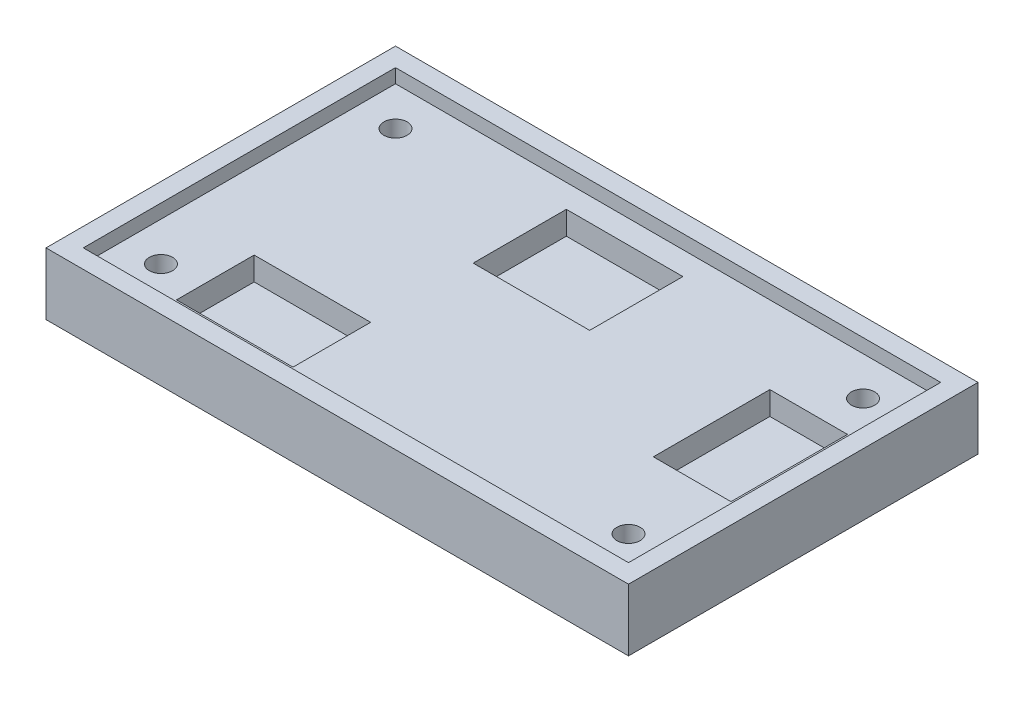
ISO-10303-21;
HEADER;
FILE_DESCRIPTION(('STEP AP214'),'2;1');
FILE_NAME('part.step','',(''),(''),'','','');
FILE_SCHEMA(('AUTOMOTIVE_DESIGN { 1 0 10303 214 1 1 1 1 }'));
ENDSEC;
DATA;
#1=APPLICATION_CONTEXT('core data for automotive mechanical design processes');
#2=APPLICATION_PROTOCOL_DEFINITION('international standard','automotive_design',2000,#1);
#3=PRODUCT_CONTEXT('',#1,'mechanical');
#4=PRODUCT('Part','Part','',(#3));
#5=PRODUCT_RELATED_PRODUCT_CATEGORY('part','',(#4));
#6=PRODUCT_DEFINITION_FORMATION('','',#4);
#7=PRODUCT_DEFINITION_CONTEXT('part definition',#1,'design');
#8=PRODUCT_DEFINITION('design','',#6,#7);
#9=PRODUCT_DEFINITION_SHAPE('','',#8);
#10=(LENGTH_UNIT() NAMED_UNIT(*) SI_UNIT(.MILLI.,.METRE.));
#11=(NAMED_UNIT(*) PLANE_ANGLE_UNIT() SI_UNIT($,.RADIAN.));
#12=(NAMED_UNIT(*) SI_UNIT($,.STERADIAN.) SOLID_ANGLE_UNIT());
#13=UNCERTAINTY_MEASURE_WITH_UNIT(LENGTH_MEASURE(1.E-05),#10,'distance_accuracy_value','');
#14=(GEOMETRIC_REPRESENTATION_CONTEXT(3) GLOBAL_UNCERTAINTY_ASSIGNED_CONTEXT((#13)) GLOBAL_UNIT_ASSIGNED_CONTEXT((#10,
#11,#12)) REPRESENTATION_CONTEXT('',''));
#15=CARTESIAN_POINT('',(0.,0.,0.));
#16=DIRECTION('',(0.,0.,1.));
#17=DIRECTION('',(1.,0.,0.));
#18=AXIS2_PLACEMENT_3D('',#15,#16,#17);
#19=CARTESIAN_POINT('',(0.,8.,-45.));
#20=DIRECTION('',(0.,0.,-1.));
#21=DIRECTION('',(-1.,0.,0.));
#22=AXIS2_PLACEMENT_3D('',#19,#20,#21);
#23=PLANE('',#22);
#24=DIRECTION('',(1.,0.,0.));
#25=VECTOR('',#24,1.);
#26=CARTESIAN_POINT('',(0.,0.,-45.));
#27=LINE('',#26,#25);
#28=CARTESIAN_POINT('',(0.,0.,-45.));
#29=VERTEX_POINT('',#28);
#30=CARTESIAN_POINT('',(75.,0.,-45.));
#31=VERTEX_POINT('',#30);
#32=EDGE_CURVE('E328',#29,#31,#27,.T.);
#33=ORIENTED_EDGE('',*,*,#32,.F.);
#34=DIRECTION('',(0.,-1.,0.));
#35=VECTOR('',#34,1.);
#36=CARTESIAN_POINT('',(0.,8.,-45.));
#37=LINE('',#36,#35);
#38=CARTESIAN_POINT('',(0.,8.,-45.));
#39=VERTEX_POINT('',#38);
#40=EDGE_CURVE('E11',#39,#29,#37,.T.);
#41=ORIENTED_EDGE('',*,*,#40,.F.);
#42=DIRECTION('',(1.,0.,0.));
#43=VECTOR('',#42,1.);
#44=CARTESIAN_POINT('',(0.,8.,-45.));
#45=LINE('',#44,#43);
#46=CARTESIAN_POINT('',(75.,8.,-45.));
#47=VERTEX_POINT('',#46);
#48=EDGE_CURVE('E335',#39,#47,#45,.T.);
#49=ORIENTED_EDGE('',*,*,#48,.T.);
#50=DIRECTION('',(0.,-1.,0.));
#51=VECTOR('',#50,1.);
#52=CARTESIAN_POINT('',(75.,8.,-45.));
#53=LINE('',#52,#51);
#54=EDGE_CURVE('E44',#47,#31,#53,.T.);
#55=ORIENTED_EDGE('',*,*,#54,.T.);
#56=EDGE_LOOP('',(#33,#41,#49,#55));
#57=FACE_BOUND('',#56,.T.);
#58=ADVANCED_FACE('F41',(#57),#23,.T.);
#59=CARTESIAN_POINT('',(0.,8.,0.));
#60=DIRECTION('',(-1.,0.,0.));
#61=DIRECTION('',(0.,0.,1.));
#62=AXIS2_PLACEMENT_3D('',#59,#60,#61);
#63=PLANE('',#62);
#64=DIRECTION('',(0.,0.,-1.));
#65=VECTOR('',#64,1.);
#66=CARTESIAN_POINT('',(0.,0.,0.));
#67=LINE('',#66,#65);
#68=CARTESIAN_POINT('',(0.,0.,0.));
#69=VERTEX_POINT('',#68);
#70=EDGE_CURVE('E339',#69,#29,#67,.T.);
#71=ORIENTED_EDGE('',*,*,#70,.F.);
#72=DIRECTION('',(0.,-1.,0.));
#73=VECTOR('',#72,1.);
#74=CARTESIAN_POINT('',(0.,8.,0.));
#75=LINE('',#74,#73);
#76=CARTESIAN_POINT('',(0.,8.,0.));
#77=VERTEX_POINT('',#76);
#78=EDGE_CURVE('E49',#77,#69,#75,.T.);
#79=ORIENTED_EDGE('',*,*,#78,.F.);
#80=DIRECTION('',(0.,0.,-1.));
#81=VECTOR('',#80,1.);
#82=CARTESIAN_POINT('',(0.,8.,0.));
#83=LINE('',#82,#81);
#84=EDGE_CURVE('E343',#77,#39,#83,.T.);
#85=ORIENTED_EDGE('',*,*,#84,.T.);
#86=ORIENTED_EDGE('',*,*,#40,.T.);
#87=EDGE_LOOP('',(#71,#79,#85,#86));
#88=FACE_BOUND('',#87,.T.);
#89=ADVANCED_FACE('F371',(#88),#63,.T.);
#90=CARTESIAN_POINT('',(0.,8.,0.));
#91=DIRECTION('',(0.,0.,-1.));
#92=DIRECTION('',(-1.,0.,0.));
#93=AXIS2_PLACEMENT_3D('',#90,#91,#92);
#94=PLANE('',#93);
#95=DIRECTION('',(1.,0.,0.));
#96=VECTOR('',#95,1.);
#97=CARTESIAN_POINT('',(0.,0.,0.));
#98=LINE('',#97,#96);
#99=CARTESIAN_POINT('',(75.,0.,0.));
#100=VERTEX_POINT('',#99);
#101=EDGE_CURVE('E351',#69,#100,#98,.T.);
#102=ORIENTED_EDGE('',*,*,#101,.T.);
#103=DIRECTION('',(0.,-1.,0.));
#104=VECTOR('',#103,1.);
#105=CARTESIAN_POINT('',(75.,8.,0.));
#106=LINE('',#105,#104);
#107=CARTESIAN_POINT('',(75.,8.,0.));
#108=VERTEX_POINT('',#107);
#109=EDGE_CURVE('E355',#108,#100,#106,.T.);
#110=ORIENTED_EDGE('',*,*,#109,.F.);
#111=DIRECTION('',(1.,0.,0.));
#112=VECTOR('',#111,1.);
#113=CARTESIAN_POINT('',(0.,8.,0.));
#114=LINE('',#113,#112);
#115=EDGE_CURVE('E341',#77,#108,#114,.T.);
#116=ORIENTED_EDGE('',*,*,#115,.F.);
#117=ORIENTED_EDGE('',*,*,#78,.T.);
#118=EDGE_LOOP('',(#102,#110,#116,#117));
#119=FACE_BOUND('',#118,.T.);
#120=ADVANCED_FACE('F377',(#119),#94,.F.);
#121=CARTESIAN_POINT('',(75.,8.,0.));
#122=DIRECTION('',(-1.,0.,0.));
#123=DIRECTION('',(0.,0.,1.));
#124=AXIS2_PLACEMENT_3D('',#121,#122,#123);
#125=PLANE('',#124);
#126=DIRECTION('',(0.,0.,-1.));
#127=VECTOR('',#126,1.);
#128=CARTESIAN_POINT('',(75.,0.,0.));
#129=LINE('',#128,#127);
#130=EDGE_CURVE('E348',#100,#31,#129,.T.);
#131=ORIENTED_EDGE('',*,*,#130,.T.);
#132=ORIENTED_EDGE('',*,*,#54,.F.);
#133=DIRECTION('',(0.,0.,-1.));
#134=VECTOR('',#133,1.);
#135=CARTESIAN_POINT('',(75.,8.,0.));
#136=LINE('',#135,#134);
#137=EDGE_CURVE('E338',#108,#47,#136,.T.);
#138=ORIENTED_EDGE('',*,*,#137,.F.);
#139=ORIENTED_EDGE('',*,*,#109,.T.);
#140=EDGE_LOOP('',(#131,#132,#138,#139));
#141=FACE_BOUND('',#140,.T.);
#142=ADVANCED_FACE('F365',(#141),#125,.F.);
#143=CARTESIAN_POINT('',(0.,8.,0.));
#144=DIRECTION('',(0.,1.,0.));
#145=DIRECTION('',(0.,0.,1.));
#146=AXIS2_PLACEMENT_3D('',#143,#144,#145);
#147=PLANE('',#146);
#148=DIRECTION('',(0.,0.,1.));
#149=VECTOR('',#148,1.);
#150=CARTESIAN_POINT('',(2.4,8.,-42.6));
#151=LINE('',#150,#149);
#152=CARTESIAN_POINT('',(2.4,8.,-42.6));
#153=VERTEX_POINT('',#152);
#154=CARTESIAN_POINT('',(2.4,8.,-2.4));
#155=VERTEX_POINT('',#154);
#156=EDGE_CURVE('E300',#153,#155,#151,.T.);
#157=ORIENTED_EDGE('',*,*,#156,.F.);
#158=DIRECTION('',(-1.,0.,0.));
#159=VECTOR('',#158,1.);
#160=CARTESIAN_POINT('',(72.6,8.,-42.6));
#161=LINE('',#160,#159);
#162=CARTESIAN_POINT('',(72.6,8.,-42.6));
#163=VERTEX_POINT('',#162);
#164=EDGE_CURVE('E307',#163,#153,#161,.T.);
#165=ORIENTED_EDGE('',*,*,#164,.F.);
#166=DIRECTION('',(0.,0.,-1.));
#167=VECTOR('',#166,1.);
#168=CARTESIAN_POINT('',(72.6,8.,-2.4));
#169=LINE('',#168,#167);
#170=CARTESIAN_POINT('',(72.6,8.,-2.4));
#171=VERTEX_POINT('',#170);
#172=EDGE_CURVE('E321',#171,#163,#169,.T.);
#173=ORIENTED_EDGE('',*,*,#172,.F.);
#174=DIRECTION('',(1.,0.,0.));
#175=VECTOR('',#174,1.);
#176=CARTESIAN_POINT('',(2.4,8.,-2.4));
#177=LINE('',#176,#175);
#178=EDGE_CURVE('E318',#155,#171,#177,.T.);
#179=ORIENTED_EDGE('',*,*,#178,.F.);
#180=EDGE_LOOP('',(#157,#165,#173,#179));
#181=FACE_BOUND('',#180,.T.);
#182=ORIENTED_EDGE('',*,*,#48,.F.);
#183=ORIENTED_EDGE('',*,*,#84,.F.);
#184=ORIENTED_EDGE('',*,*,#115,.T.);
#185=ORIENTED_EDGE('',*,*,#137,.T.);
#186=EDGE_LOOP('',(#182,#183,#184,#185));
#187=FACE_BOUND('',#186,.T.);
#188=ADVANCED_FACE('F375',(#181,#187),#147,.T.);
#189=CARTESIAN_POINT('',(0.,0.,0.));
#190=DIRECTION('',(0.,1.,0.));
#191=DIRECTION('',(0.,0.,1.));
#192=AXIS2_PLACEMENT_3D('',#189,#190,#191);
#193=PLANE('',#192);
#194=ORIENTED_EDGE('',*,*,#32,.T.);
#195=ORIENTED_EDGE('',*,*,#130,.F.);
#196=ORIENTED_EDGE('',*,*,#101,.F.);
#197=ORIENTED_EDGE('',*,*,#70,.T.);
#198=EDGE_LOOP('',(#194,#195,#196,#197));
#199=FACE_BOUND('',#198,.T.);
#200=ADVANCED_FACE('F368',(#199),#193,.F.);
#201=CARTESIAN_POINT('',(2.4,6.2,-42.6));
#202=DIRECTION('',(-1.,0.,0.));
#203=DIRECTION('',(0.,0.,1.));
#204=AXIS2_PLACEMENT_3D('',#201,#202,#203);
#205=PLANE('',#204);
#206=ORIENTED_EDGE('',*,*,#156,.T.);
#207=DIRECTION('',(0.,1.,0.));
#208=VECTOR('',#207,1.);
#209=CARTESIAN_POINT('',(2.4,6.2,-2.4));
#210=LINE('',#209,#208);
#211=CARTESIAN_POINT('',(2.4,6.2,-2.4));
#212=VERTEX_POINT('',#211);
#213=EDGE_CURVE('E316',#212,#155,#210,.T.);
#214=ORIENTED_EDGE('',*,*,#213,.F.);
#215=DIRECTION('',(0.,0.,1.));
#216=VECTOR('',#215,1.);
#217=CARTESIAN_POINT('',(2.4,6.2,-42.6));
#218=LINE('',#217,#216);
#219=CARTESIAN_POINT('',(2.4,6.2,-42.6));
#220=VERTEX_POINT('',#219);
#221=EDGE_CURVE('E303',#220,#212,#218,.T.);
#222=ORIENTED_EDGE('',*,*,#221,.F.);
#223=DIRECTION('',(0.,1.,0.));
#224=VECTOR('',#223,1.);
#225=CARTESIAN_POINT('',(2.4,6.2,-42.6));
#226=LINE('',#225,#224);
#227=EDGE_CURVE('E326',#220,#153,#226,.T.);
#228=ORIENTED_EDGE('',*,*,#227,.T.);
#229=EDGE_LOOP('',(#206,#214,#222,#228));
#230=FACE_BOUND('',#229,.T.);
#231=ADVANCED_FACE('F423',(#230),#205,.F.);
#232=CARTESIAN_POINT('',(72.6,6.2,-42.6));
#233=DIRECTION('',(0.,0.,-1.));
#234=DIRECTION('',(-1.,0.,0.));
#235=AXIS2_PLACEMENT_3D('',#232,#233,#234);
#236=PLANE('',#235);
#237=ORIENTED_EDGE('',*,*,#164,.T.);
#238=ORIENTED_EDGE('',*,*,#227,.F.);
#239=DIRECTION('',(-1.,0.,0.));
#240=VECTOR('',#239,1.);
#241=CARTESIAN_POINT('',(72.6,6.2,-42.6));
#242=LINE('',#241,#240);
#243=CARTESIAN_POINT('',(72.6,6.2,-42.6));
#244=VERTEX_POINT('',#243);
#245=EDGE_CURVE('E313',#244,#220,#242,.T.);
#246=ORIENTED_EDGE('',*,*,#245,.F.);
#247=DIRECTION('',(0.,1.,0.));
#248=VECTOR('',#247,1.);
#249=CARTESIAN_POINT('',(72.6,6.2,-42.6));
#250=LINE('',#249,#248);
#251=EDGE_CURVE('E329',#244,#163,#250,.T.);
#252=ORIENTED_EDGE('',*,*,#251,.T.);
#253=EDGE_LOOP('',(#237,#238,#246,#252));
#254=FACE_BOUND('',#253,.T.);
#255=ADVANCED_FACE('F431',(#254),#236,.F.);
#256=CARTESIAN_POINT('',(72.6,6.2,-2.4));
#257=DIRECTION('',(1.,0.,0.));
#258=DIRECTION('',(0.,0.,-1.));
#259=AXIS2_PLACEMENT_3D('',#256,#257,#258);
#260=PLANE('',#259);
#261=ORIENTED_EDGE('',*,*,#172,.T.);
#262=ORIENTED_EDGE('',*,*,#251,.F.);
#263=DIRECTION('',(0.,0.,-1.));
#264=VECTOR('',#263,1.);
#265=CARTESIAN_POINT('',(72.6,6.2,-2.4));
#266=LINE('',#265,#264);
#267=CARTESIAN_POINT('',(72.6,6.2,-2.4));
#268=VERTEX_POINT('',#267);
#269=EDGE_CURVE('E310',#268,#244,#266,.T.);
#270=ORIENTED_EDGE('',*,*,#269,.F.);
#271=DIRECTION('',(0.,1.,0.));
#272=VECTOR('',#271,1.);
#273=CARTESIAN_POINT('',(72.6,6.2,-2.4));
#274=LINE('',#273,#272);
#275=EDGE_CURVE('E331',#268,#171,#274,.T.);
#276=ORIENTED_EDGE('',*,*,#275,.T.);
#277=EDGE_LOOP('',(#261,#262,#270,#276));
#278=FACE_BOUND('',#277,.T.);
#279=ADVANCED_FACE('F441',(#278),#260,.F.);
#280=CARTESIAN_POINT('',(2.4,6.2,-2.4));
#281=DIRECTION('',(0.,0.,1.));
#282=DIRECTION('',(1.,0.,0.));
#283=AXIS2_PLACEMENT_3D('',#280,#281,#282);
#284=PLANE('',#283);
#285=ORIENTED_EDGE('',*,*,#178,.T.);
#286=ORIENTED_EDGE('',*,*,#275,.F.);
#287=DIRECTION('',(1.,0.,0.));
#288=VECTOR('',#287,1.);
#289=CARTESIAN_POINT('',(2.4,6.2,-2.4));
#290=LINE('',#289,#288);
#291=EDGE_CURVE('E306',#212,#268,#290,.T.);
#292=ORIENTED_EDGE('',*,*,#291,.F.);
#293=ORIENTED_EDGE('',*,*,#213,.T.);
#294=EDGE_LOOP('',(#285,#286,#292,#293));
#295=FACE_BOUND('',#294,.T.);
#296=ADVANCED_FACE('F451',(#295),#284,.F.);
#297=CARTESIAN_POINT('',(0.,6.2,0.));
#298=DIRECTION('',(0.,1.,0.));
#299=DIRECTION('',(0.,0.,1.));
#300=AXIS2_PLACEMENT_3D('',#297,#298,#299);
#301=PLANE('',#300);
#302=DIRECTION('',(0.,0.,1.));
#303=VECTOR('',#302,1.);
#304=CARTESIAN_POINT('',(12.4,6.2,-14.4));
#305=LINE('',#304,#303);
#306=CARTESIAN_POINT('',(12.4,6.2,-14.4));
#307=VERTEX_POINT('',#306);
#308=CARTESIAN_POINT('',(12.4,6.2,-4.4));
#309=VERTEX_POINT('',#308);
#310=EDGE_CURVE('E57',#307,#309,#305,.T.);
#311=ORIENTED_EDGE('',*,*,#310,.F.);
#312=DIRECTION('',(-1.,0.,0.));
#313=VECTOR('',#312,1.);
#314=CARTESIAN_POINT('',(12.4,6.2,-14.4));
#315=LINE('',#314,#313);
#316=CARTESIAN_POINT('',(27.4,6.2,-14.4));
#317=VERTEX_POINT('',#316);
#318=EDGE_CURVE('E198',#317,#307,#315,.T.);
#319=ORIENTED_EDGE('',*,*,#318,.F.);
#320=DIRECTION('',(0.,0.,-1.));
#321=VECTOR('',#320,1.);
#322=CARTESIAN_POINT('',(27.4,6.2,-14.4));
#323=LINE('',#322,#321);
#324=CARTESIAN_POINT('',(27.4,6.2,-4.4));
#325=VERTEX_POINT('',#324);
#326=EDGE_CURVE('E201',#325,#317,#323,.T.);
#327=ORIENTED_EDGE('',*,*,#326,.F.);
#328=DIRECTION('',(1.,0.,0.));
#329=VECTOR('',#328,1.);
#330=CARTESIAN_POINT('',(12.4,6.2,-4.4));
#331=LINE('',#330,#329);
#332=EDGE_CURVE('E207',#309,#325,#331,.T.);
#333=ORIENTED_EDGE('',*,*,#332,.F.);
#334=EDGE_LOOP('',(#311,#319,#327,#333));
#335=FACE_BOUND('',#334,.T.);
#336=DIRECTION('',(0.,0.,1.));
#337=VECTOR('',#336,1.);
#338=CARTESIAN_POINT('',(60.6,6.2,-32.6));
#339=LINE('',#338,#337);
#340=CARTESIAN_POINT('',(60.6,6.2,-32.6));
#341=VERTEX_POINT('',#340);
#342=CARTESIAN_POINT('',(60.6,6.2,-17.6));
#343=VERTEX_POINT('',#342);
#344=EDGE_CURVE('E65',#341,#343,#339,.T.);
#345=ORIENTED_EDGE('',*,*,#344,.F.);
#346=DIRECTION('',(-1.,0.,0.));
#347=VECTOR('',#346,1.);
#348=CARTESIAN_POINT('',(60.6,6.2,-32.6));
#349=LINE('',#348,#347);
#350=CARTESIAN_POINT('',(70.6,6.2,-32.6));
#351=VERTEX_POINT('',#350);
#352=EDGE_CURVE('E227',#351,#341,#349,.T.);
#353=ORIENTED_EDGE('',*,*,#352,.F.);
#354=DIRECTION('',(0.,0.,-1.));
#355=VECTOR('',#354,1.);
#356=CARTESIAN_POINT('',(70.6,6.2,-32.6));
#357=LINE('',#356,#355);
#358=CARTESIAN_POINT('',(70.6,6.2,-17.6));
#359=VERTEX_POINT('',#358);
#360=EDGE_CURVE('E230',#359,#351,#357,.T.);
#361=ORIENTED_EDGE('',*,*,#360,.F.);
#362=DIRECTION('',(1.,0.,0.));
#363=VECTOR('',#362,1.);
#364=CARTESIAN_POINT('',(60.6,6.2,-17.6));
#365=LINE('',#364,#363);
#366=EDGE_CURVE('E234',#343,#359,#365,.T.);
#367=ORIENTED_EDGE('',*,*,#366,.F.);
#368=EDGE_LOOP('',(#345,#353,#361,#367));
#369=FACE_BOUND('',#368,.T.);
#370=DIRECTION('',(0.,0.,1.));
#371=VECTOR('',#370,1.);
#372=CARTESIAN_POINT('',(27.4,6.2,-39.6));
#373=LINE('',#372,#371);
#374=CARTESIAN_POINT('',(27.4,6.2,-39.6));
#375=VERTEX_POINT('',#374);
#376=CARTESIAN_POINT('',(27.4,6.2,-27.6));
#377=VERTEX_POINT('',#376);
#378=EDGE_CURVE('E226',#375,#377,#373,.T.);
#379=ORIENTED_EDGE('',*,*,#378,.F.);
#380=DIRECTION('',(-1.,0.,0.));
#381=VECTOR('',#380,1.);
#382=CARTESIAN_POINT('',(27.4,6.2,-39.6));
#383=LINE('',#382,#381);
#384=CARTESIAN_POINT('',(42.4,6.2,-39.6));
#385=VERTEX_POINT('',#384);
#386=EDGE_CURVE('E258',#385,#375,#383,.T.);
#387=ORIENTED_EDGE('',*,*,#386,.F.);
#388=DIRECTION('',(0.,0.,-1.));
#389=VECTOR('',#388,1.);
#390=CARTESIAN_POINT('',(42.4,6.2,-39.6));
#391=LINE('',#390,#389);
#392=CARTESIAN_POINT('',(42.4,6.2,-27.6));
#393=VERTEX_POINT('',#392);
#394=EDGE_CURVE('E261',#393,#385,#391,.T.);
#395=ORIENTED_EDGE('',*,*,#394,.F.);
#396=DIRECTION('',(1.,0.,0.));
#397=VECTOR('',#396,1.);
#398=CARTESIAN_POINT('',(27.4,6.2,-27.6));
#399=LINE('',#398,#397);
#400=EDGE_CURVE('E265',#377,#393,#399,.T.);
#401=ORIENTED_EDGE('',*,*,#400,.F.);
#402=EDGE_LOOP('',(#379,#387,#395,#401));
#403=FACE_BOUND('',#402,.T.);
#404=CARTESIAN_POINT('',(67.6,6.2,-37.6));
#405=DIRECTION('',(0.,1.,0.));
#406=DIRECTION('',(0.,0.,-1.));
#407=AXIS2_PLACEMENT_3D('',#404,#405,#406);
#408=CIRCLE('',#407,1.50000000000001);
#409=CARTESIAN_POINT('',(67.6,6.2,-39.1));
#410=VERTEX_POINT('',#409);
#411=EDGE_CURVE('E285',#410,#410,#408,.T.);
#412=ORIENTED_EDGE('',*,*,#411,.F.);
#413=EDGE_LOOP('',(#412));
#414=FACE_BOUND('',#413,.T.);
#415=CARTESIAN_POINT('',(7.4,6.2,-7.4));
#416=DIRECTION('',(0.,1.,0.));
#417=DIRECTION('',(0.,0.,-1.));
#418=AXIS2_PLACEMENT_3D('',#415,#416,#417);
#419=CIRCLE('',#418,1.5);
#420=CARTESIAN_POINT('',(7.4,6.2,-8.9));
#421=VERTEX_POINT('',#420);
#422=EDGE_CURVE('E292',#421,#421,#419,.T.);
#423=ORIENTED_EDGE('',*,*,#422,.F.);
#424=EDGE_LOOP('',(#423));
#425=FACE_BOUND('',#424,.T.);
#426=CARTESIAN_POINT('',(67.6,6.2,-7.4));
#427=DIRECTION('',(0.,1.,0.));
#428=DIRECTION('',(0.,0.,1.));
#429=AXIS2_PLACEMENT_3D('',#426,#427,#428);
#430=CIRCLE('',#429,1.50000000000001);
#431=CARTESIAN_POINT('',(67.6,6.2,-5.89999999999999));
#432=VERTEX_POINT('',#431);
#433=EDGE_CURVE('E279',#432,#432,#430,.T.);
#434=ORIENTED_EDGE('',*,*,#433,.F.);
#435=EDGE_LOOP('',(#434));
#436=FACE_BOUND('',#435,.T.);
#437=CARTESIAN_POINT('',(7.4,6.2,-37.6));
#438=DIRECTION('',(0.,1.,0.));
#439=DIRECTION('',(0.,0.,1.));
#440=AXIS2_PLACEMENT_3D('',#437,#438,#439);
#441=CIRCLE('',#440,1.5);
#442=CARTESIAN_POINT('',(7.4,6.2,-36.1));
#443=VERTEX_POINT('',#442);
#444=EDGE_CURVE('E288',#443,#443,#441,.T.);
#445=ORIENTED_EDGE('',*,*,#444,.F.);
#446=EDGE_LOOP('',(#445));
#447=FACE_BOUND('',#446,.T.);
#448=ORIENTED_EDGE('',*,*,#221,.T.);
#449=ORIENTED_EDGE('',*,*,#291,.T.);
#450=ORIENTED_EDGE('',*,*,#269,.T.);
#451=ORIENTED_EDGE('',*,*,#245,.T.);
#452=EDGE_LOOP('',(#448,#449,#450,#451));
#453=FACE_BOUND('',#452,.T.);
#454=ADVANCED_FACE('F461',(#335,#369,#403,#414,#425,#436,#447,#453),#301,.T.);
#455=CARTESIAN_POINT('',(7.4,4.,-37.6));
#456=DIRECTION('',(0.,1.,0.));
#457=DIRECTION('',(0.,0.,1.));
#458=AXIS2_PLACEMENT_3D('',#455,#456,#457);
#459=CYLINDRICAL_SURFACE('',#458,1.5);
#460=CARTESIAN_POINT('',(7.4,4.,-37.6));
#461=DIRECTION('',(0.,1.,0.));
#462=DIRECTION('',(0.,0.,1.));
#463=AXIS2_PLACEMENT_3D('',#460,#461,#462);
#464=CIRCLE('',#463,1.5);
#465=CARTESIAN_POINT('',(7.4,4.,-36.1));
#466=VERTEX_POINT('',#465);
#467=EDGE_CURVE('E297',#466,#466,#464,.T.);
#468=ORIENTED_EDGE('',*,*,#467,.F.);
#469=EDGE_LOOP('',(#468));
#470=FACE_BOUND('',#469,.T.);
#471=ORIENTED_EDGE('',*,*,#444,.T.);
#472=EDGE_LOOP('',(#471));
#473=FACE_BOUND('',#472,.T.);
#474=ADVANCED_FACE('F472',(#470,#473),#459,.F.);
#475=CARTESIAN_POINT('',(7.4,4.,-37.6));
#476=DIRECTION('',(0.,1.,0.));
#477=DIRECTION('',(0.,0.,1.));
#478=AXIS2_PLACEMENT_3D('',#475,#476,#477);
#479=PLANE('',#478);
#480=ORIENTED_EDGE('',*,*,#467,.T.);
#481=EDGE_LOOP('',(#480));
#482=FACE_BOUND('',#481,.T.);
#483=ADVANCED_FACE('F483',(#482),#479,.T.);
#484=CARTESIAN_POINT('',(67.6,4.,-7.4));
#485=DIRECTION('',(0.,1.,0.));
#486=DIRECTION('',(0.,0.,1.));
#487=AXIS2_PLACEMENT_3D('',#484,#485,#486);
#488=CYLINDRICAL_SURFACE('',#487,1.50000000000001);
#489=CARTESIAN_POINT('',(67.6,4.,-7.4));
#490=DIRECTION('',(0.,1.,0.));
#491=DIRECTION('',(0.,0.,1.));
#492=AXIS2_PLACEMENT_3D('',#489,#490,#491);
#493=CIRCLE('',#492,1.50000000000001);
#494=CARTESIAN_POINT('',(67.6,4.,-5.89999999999999));
#495=VERTEX_POINT('',#494);
#496=EDGE_CURVE('E213',#495,#495,#493,.T.);
#497=ORIENTED_EDGE('',*,*,#496,.F.);
#498=EDGE_LOOP('',(#497));
#499=FACE_BOUND('',#498,.T.);
#500=ORIENTED_EDGE('',*,*,#433,.T.);
#501=EDGE_LOOP('',(#500));
#502=FACE_BOUND('',#501,.T.);
#503=ADVANCED_FACE('F493',(#499,#502),#488,.F.);
#504=CARTESIAN_POINT('',(67.6,4.,-7.4));
#505=DIRECTION('',(0.,1.,0.));
#506=DIRECTION('',(0.,0.,1.));
#507=AXIS2_PLACEMENT_3D('',#504,#505,#506);
#508=PLANE('',#507);
#509=ORIENTED_EDGE('',*,*,#496,.T.);
#510=EDGE_LOOP('',(#509));
#511=FACE_BOUND('',#510,.T.);
#512=ADVANCED_FACE('F503',(#511),#508,.T.);
#513=CARTESIAN_POINT('',(7.4,4.,-7.4));
#514=DIRECTION('',(0.,1.,0.));
#515=DIRECTION('',(0.,0.,1.));
#516=AXIS2_PLACEMENT_3D('',#513,#514,#515);
#517=CYLINDRICAL_SURFACE('',#516,1.5);
#518=CARTESIAN_POINT('',(7.4,4.,-7.4));
#519=DIRECTION('',(0.,1.,0.));
#520=DIRECTION('',(0.,0.,-1.));
#521=AXIS2_PLACEMENT_3D('',#518,#519,#520);
#522=CIRCLE('',#521,1.5);
#523=CARTESIAN_POINT('',(7.4,4.,-8.9));
#524=VERTEX_POINT('',#523);
#525=EDGE_CURVE('E282',#524,#524,#522,.T.);
#526=ORIENTED_EDGE('',*,*,#525,.F.);
#527=EDGE_LOOP('',(#526));
#528=FACE_BOUND('',#527,.T.);
#529=ORIENTED_EDGE('',*,*,#422,.T.);
#530=EDGE_LOOP('',(#529));
#531=FACE_BOUND('',#530,.T.);
#532=ADVANCED_FACE('F513',(#528,#531),#517,.F.);
#533=CARTESIAN_POINT('',(7.4,4.,-7.4));
#534=DIRECTION('',(0.,-1.,0.));
#535=DIRECTION('',(0.,0.,-1.));
#536=AXIS2_PLACEMENT_3D('',#533,#534,#535);
#537=PLANE('',#536);
#538=ORIENTED_EDGE('',*,*,#525,.T.);
#539=EDGE_LOOP('',(#538));
#540=FACE_BOUND('',#539,.T.);
#541=ADVANCED_FACE('F523',(#540),#537,.F.);
#542=CARTESIAN_POINT('',(67.6,4.,-37.6));
#543=DIRECTION('',(0.,1.,0.));
#544=DIRECTION('',(0.,0.,1.));
#545=AXIS2_PLACEMENT_3D('',#542,#543,#544);
#546=CYLINDRICAL_SURFACE('',#545,1.50000000000001);
#547=CARTESIAN_POINT('',(67.6,4.,-37.6));
#548=DIRECTION('',(0.,1.,0.));
#549=DIRECTION('',(0.,0.,-1.));
#550=AXIS2_PLACEMENT_3D('',#547,#548,#549);
#551=CIRCLE('',#550,1.50000000000001);
#552=CARTESIAN_POINT('',(67.6,4.,-39.1));
#553=VERTEX_POINT('',#552);
#554=EDGE_CURVE('E289',#553,#553,#551,.T.);
#555=ORIENTED_EDGE('',*,*,#554,.F.);
#556=EDGE_LOOP('',(#555));
#557=FACE_BOUND('',#556,.T.);
#558=ORIENTED_EDGE('',*,*,#411,.T.);
#559=EDGE_LOOP('',(#558));
#560=FACE_BOUND('',#559,.T.);
#561=ADVANCED_FACE('F533',(#557,#560),#546,.F.);
#562=CARTESIAN_POINT('',(67.6,4.,-37.6));
#563=DIRECTION('',(0.,-1.,0.));
#564=DIRECTION('',(0.,0.,-1.));
#565=AXIS2_PLACEMENT_3D('',#562,#563,#564);
#566=PLANE('',#565);
#567=ORIENTED_EDGE('',*,*,#554,.T.);
#568=EDGE_LOOP('',(#567));
#569=FACE_BOUND('',#568,.T.);
#570=ADVANCED_FACE('F543',(#569),#566,.F.);
#571=CARTESIAN_POINT('',(27.4,3.2,-39.6));
#572=DIRECTION('',(-1.,0.,0.));
#573=DIRECTION('',(0.,0.,1.));
#574=AXIS2_PLACEMENT_3D('',#571,#572,#573);
#575=PLANE('',#574);
#576=ORIENTED_EDGE('',*,*,#378,.T.);
#577=DIRECTION('',(0.,1.,0.));
#578=VECTOR('',#577,1.);
#579=CARTESIAN_POINT('',(27.4,3.2,-27.6));
#580=LINE('',#579,#578);
#581=CARTESIAN_POINT('',(27.4,3.2,-27.6));
#582=VERTEX_POINT('',#581);
#583=EDGE_CURVE('E248',#582,#377,#580,.T.);
#584=ORIENTED_EDGE('',*,*,#583,.F.);
#585=DIRECTION('',(0.,0.,1.));
#586=VECTOR('',#585,1.);
#587=CARTESIAN_POINT('',(27.4,3.2,-39.6));
#588=LINE('',#587,#586);
#589=CARTESIAN_POINT('',(27.4,3.2,-39.6));
#590=VERTEX_POINT('',#589);
#591=EDGE_CURVE('E262',#590,#582,#588,.T.);
#592=ORIENTED_EDGE('',*,*,#591,.F.);
#593=DIRECTION('',(0.,1.,0.));
#594=VECTOR('',#593,1.);
#595=CARTESIAN_POINT('',(27.4,3.2,-39.6));
#596=LINE('',#595,#594);
#597=EDGE_CURVE('E256',#590,#375,#596,.T.);
#598=ORIENTED_EDGE('',*,*,#597,.T.);
#599=EDGE_LOOP('',(#576,#584,#592,#598));
#600=FACE_BOUND('',#599,.T.);
#601=ADVANCED_FACE('F552',(#600),#575,.F.);
#602=CARTESIAN_POINT('',(27.4,3.2,-39.6));
#603=DIRECTION('',(0.,0.,-1.));
#604=DIRECTION('',(-1.,0.,0.));
#605=AXIS2_PLACEMENT_3D('',#602,#603,#604);
#606=PLANE('',#605);
#607=ORIENTED_EDGE('',*,*,#386,.T.);
#608=ORIENTED_EDGE('',*,*,#597,.F.);
#609=DIRECTION('',(-1.,0.,0.));
#610=VECTOR('',#609,1.);
#611=CARTESIAN_POINT('',(27.4,3.2,-39.6));
#612=LINE('',#611,#610);
#613=CARTESIAN_POINT('',(42.4,3.2,-39.6));
#614=VERTEX_POINT('',#613);
#615=EDGE_CURVE('E251',#614,#590,#612,.T.);
#616=ORIENTED_EDGE('',*,*,#615,.F.);
#617=DIRECTION('',(0.,1.,0.));
#618=VECTOR('',#617,1.);
#619=CARTESIAN_POINT('',(42.4,3.2,-39.6));
#620=LINE('',#619,#618);
#621=EDGE_CURVE('E254',#614,#385,#620,.T.);
#622=ORIENTED_EDGE('',*,*,#621,.T.);
#623=EDGE_LOOP('',(#607,#608,#616,#622));
#624=FACE_BOUND('',#623,.T.);
#625=ADVANCED_FACE('F561',(#624),#606,.F.);
#626=CARTESIAN_POINT('',(42.4,3.2,-39.6));
#627=DIRECTION('',(1.,0.,0.));
#628=DIRECTION('',(0.,0.,-1.));
#629=AXIS2_PLACEMENT_3D('',#626,#627,#628);
#630=PLANE('',#629);
#631=ORIENTED_EDGE('',*,*,#394,.T.);
#632=ORIENTED_EDGE('',*,*,#621,.F.);
#633=DIRECTION('',(0.,0.,-1.));
#634=VECTOR('',#633,1.);
#635=CARTESIAN_POINT('',(42.4,3.2,-39.6));
#636=LINE('',#635,#634);
#637=CARTESIAN_POINT('',(42.4,3.2,-27.6));
#638=VERTEX_POINT('',#637);
#639=EDGE_CURVE('E271',#638,#614,#636,.T.);
#640=ORIENTED_EDGE('',*,*,#639,.F.);
#641=DIRECTION('',(0.,1.,0.));
#642=VECTOR('',#641,1.);
#643=CARTESIAN_POINT('',(42.4,3.2,-27.6));
#644=LINE('',#643,#642);
#645=EDGE_CURVE('E252',#638,#393,#644,.T.);
#646=ORIENTED_EDGE('',*,*,#645,.T.);
#647=EDGE_LOOP('',(#631,#632,#640,#646));
#648=FACE_BOUND('',#647,.T.);
#649=ADVANCED_FACE('F571',(#648),#630,.F.);
#650=CARTESIAN_POINT('',(27.4,3.2,-27.6));
#651=DIRECTION('',(0.,0.,1.));
#652=DIRECTION('',(1.,0.,0.));
#653=AXIS2_PLACEMENT_3D('',#650,#651,#652);
#654=PLANE('',#653);
#655=ORIENTED_EDGE('',*,*,#400,.T.);
#656=ORIENTED_EDGE('',*,*,#645,.F.);
#657=DIRECTION('',(1.,0.,0.));
#658=VECTOR('',#657,1.);
#659=CARTESIAN_POINT('',(27.4,3.2,-27.6));
#660=LINE('',#659,#658);
#661=EDGE_CURVE('E274',#582,#638,#660,.T.);
#662=ORIENTED_EDGE('',*,*,#661,.F.);
#663=ORIENTED_EDGE('',*,*,#583,.T.);
#664=EDGE_LOOP('',(#655,#656,#662,#663));
#665=FACE_BOUND('',#664,.T.);
#666=ADVANCED_FACE('F581',(#665),#654,.F.);
#667=CARTESIAN_POINT('',(0.,3.2,0.));
#668=DIRECTION('',(0.,1.,0.));
#669=DIRECTION('',(0.,0.,1.));
#670=AXIS2_PLACEMENT_3D('',#667,#668,#669);
#671=PLANE('',#670);
#672=ORIENTED_EDGE('',*,*,#591,.T.);
#673=ORIENTED_EDGE('',*,*,#661,.T.);
#674=ORIENTED_EDGE('',*,*,#639,.T.);
#675=ORIENTED_EDGE('',*,*,#615,.T.);
#676=EDGE_LOOP('',(#672,#673,#674,#675));
#677=FACE_BOUND('',#676,.T.);
#678=ADVANCED_FACE('F591',(#677),#671,.T.);
#679=CARTESIAN_POINT('',(60.6,3.2,-32.6));
#680=DIRECTION('',(-1.,0.,0.));
#681=DIRECTION('',(0.,0.,1.));
#682=AXIS2_PLACEMENT_3D('',#679,#680,#681);
#683=PLANE('',#682);
#684=ORIENTED_EDGE('',*,*,#344,.T.);
#685=DIRECTION('',(0.,1.,0.));
#686=VECTOR('',#685,1.);
#687=CARTESIAN_POINT('',(60.6,3.2,-17.6));
#688=LINE('',#687,#686);
#689=CARTESIAN_POINT('',(60.6,3.2,-17.6));
#690=VERTEX_POINT('',#689);
#691=EDGE_CURVE('E217',#690,#343,#688,.T.);
#692=ORIENTED_EDGE('',*,*,#691,.F.);
#693=DIRECTION('',(0.,0.,1.));
#694=VECTOR('',#693,1.);
#695=CARTESIAN_POINT('',(60.6,3.2,-32.6));
#696=LINE('',#695,#694);
#697=CARTESIAN_POINT('',(60.6,3.2,-32.6));
#698=VERTEX_POINT('',#697);
#699=EDGE_CURVE('E231',#698,#690,#696,.T.);
#700=ORIENTED_EDGE('',*,*,#699,.F.);
#701=DIRECTION('',(0.,1.,0.));
#702=VECTOR('',#701,1.);
#703=CARTESIAN_POINT('',(60.6,3.2,-32.6));
#704=LINE('',#703,#702);
#705=EDGE_CURVE('E224',#698,#341,#704,.T.);
#706=ORIENTED_EDGE('',*,*,#705,.T.);
#707=EDGE_LOOP('',(#684,#692,#700,#706));
#708=FACE_BOUND('',#707,.T.);
#709=ADVANCED_FACE('F601',(#708),#683,.F.);
#710=CARTESIAN_POINT('',(60.6,3.2,-32.6));
#711=DIRECTION('',(0.,0.,-1.));
#712=DIRECTION('',(-1.,0.,0.));
#713=AXIS2_PLACEMENT_3D('',#710,#711,#712);
#714=PLANE('',#713);
#715=ORIENTED_EDGE('',*,*,#352,.T.);
#716=ORIENTED_EDGE('',*,*,#705,.F.);
#717=DIRECTION('',(-1.,0.,0.));
#718=VECTOR('',#717,1.);
#719=CARTESIAN_POINT('',(60.6,3.2,-32.6));
#720=LINE('',#719,#718);
#721=CARTESIAN_POINT('',(70.6,3.2,-32.6));
#722=VERTEX_POINT('',#721);
#723=EDGE_CURVE('E219',#722,#698,#720,.T.);
#724=ORIENTED_EDGE('',*,*,#723,.F.);
#725=DIRECTION('',(0.,1.,0.));
#726=VECTOR('',#725,1.);
#727=CARTESIAN_POINT('',(70.6,3.2,-32.6));
#728=LINE('',#727,#726);
#729=EDGE_CURVE('E222',#722,#351,#728,.T.);
#730=ORIENTED_EDGE('',*,*,#729,.T.);
#731=EDGE_LOOP('',(#715,#716,#724,#730));
#732=FACE_BOUND('',#731,.T.);
#733=ADVANCED_FACE('F611',(#732),#714,.F.);
#734=CARTESIAN_POINT('',(70.6,3.2,-32.6));
#735=DIRECTION('',(1.,0.,0.));
#736=DIRECTION('',(0.,0.,-1.));
#737=AXIS2_PLACEMENT_3D('',#734,#735,#736);
#738=PLANE('',#737);
#739=ORIENTED_EDGE('',*,*,#360,.T.);
#740=ORIENTED_EDGE('',*,*,#729,.F.);
#741=DIRECTION('',(0.,0.,-1.));
#742=VECTOR('',#741,1.);
#743=CARTESIAN_POINT('',(70.6,3.2,-32.6));
#744=LINE('',#743,#742);
#745=CARTESIAN_POINT('',(70.6,3.2,-17.6));
#746=VERTEX_POINT('',#745);
#747=EDGE_CURVE('E240',#746,#722,#744,.T.);
#748=ORIENTED_EDGE('',*,*,#747,.F.);
#749=DIRECTION('',(0.,1.,0.));
#750=VECTOR('',#749,1.);
#751=CARTESIAN_POINT('',(70.6,3.2,-17.6));
#752=LINE('',#751,#750);
#753=EDGE_CURVE('E220',#746,#359,#752,.T.);
#754=ORIENTED_EDGE('',*,*,#753,.T.);
#755=EDGE_LOOP('',(#739,#740,#748,#754));
#756=FACE_BOUND('',#755,.T.);
#757=ADVANCED_FACE('F620',(#756),#738,.F.);
#758=CARTESIAN_POINT('',(60.6,3.2,-17.6));
#759=DIRECTION('',(0.,0.,1.));
#760=DIRECTION('',(1.,0.,0.));
#761=AXIS2_PLACEMENT_3D('',#758,#759,#760);
#762=PLANE('',#761);
#763=ORIENTED_EDGE('',*,*,#366,.T.);
#764=ORIENTED_EDGE('',*,*,#753,.F.);
#765=DIRECTION('',(1.,0.,0.));
#766=VECTOR('',#765,1.);
#767=CARTESIAN_POINT('',(60.6,3.2,-17.6));
#768=LINE('',#767,#766);
#769=EDGE_CURVE('E243',#690,#746,#768,.T.);
#770=ORIENTED_EDGE('',*,*,#769,.F.);
#771=ORIENTED_EDGE('',*,*,#691,.T.);
#772=EDGE_LOOP('',(#763,#764,#770,#771));
#773=FACE_BOUND('',#772,.T.);
#774=ADVANCED_FACE('F630',(#773),#762,.F.);
#775=CARTESIAN_POINT('',(0.,3.2,0.));
#776=DIRECTION('',(0.,1.,0.));
#777=DIRECTION('',(0.,0.,1.));
#778=AXIS2_PLACEMENT_3D('',#775,#776,#777);
#779=PLANE('',#778);
#780=ORIENTED_EDGE('',*,*,#699,.T.);
#781=ORIENTED_EDGE('',*,*,#769,.T.);
#782=ORIENTED_EDGE('',*,*,#747,.T.);
#783=ORIENTED_EDGE('',*,*,#723,.T.);
#784=EDGE_LOOP('',(#780,#781,#782,#783));
#785=FACE_BOUND('',#784,.T.);
#786=ADVANCED_FACE('F640',(#785),#779,.T.);
#787=CARTESIAN_POINT('',(12.4,3.2,-14.4));
#788=DIRECTION('',(-1.,0.,0.));
#789=DIRECTION('',(0.,0.,1.));
#790=AXIS2_PLACEMENT_3D('',#787,#788,#789);
#791=PLANE('',#790);
#792=ORIENTED_EDGE('',*,*,#310,.T.);
#793=DIRECTION('',(0.,1.,0.));
#794=VECTOR('',#793,1.);
#795=CARTESIAN_POINT('',(12.4,3.2,-4.4));
#796=LINE('',#795,#794);
#797=CARTESIAN_POINT('',(12.4,3.2,-4.4));
#798=VERTEX_POINT('',#797);
#799=EDGE_CURVE('E176',#798,#309,#796,.T.);
#800=ORIENTED_EDGE('',*,*,#799,.F.);
#801=DIRECTION('',(0.,0.,1.));
#802=VECTOR('',#801,1.);
#803=CARTESIAN_POINT('',(12.4,3.2,-14.4));
#804=LINE('',#803,#802);
#805=CARTESIAN_POINT('',(12.4,3.2,-14.4));
#806=VERTEX_POINT('',#805);
#807=EDGE_CURVE('E180',#806,#798,#804,.T.);
#808=ORIENTED_EDGE('',*,*,#807,.F.);
#809=DIRECTION('',(0.,1.,0.));
#810=VECTOR('',#809,1.);
#811=CARTESIAN_POINT('',(12.4,3.2,-14.4));
#812=LINE('',#811,#810);
#813=EDGE_CURVE('E211',#806,#307,#812,.T.);
#814=ORIENTED_EDGE('',*,*,#813,.T.);
#815=EDGE_LOOP('',(#792,#800,#808,#814));
#816=FACE_BOUND('',#815,.T.);
#817=ADVANCED_FACE('F178',(#816),#791,.F.);
#818=CARTESIAN_POINT('',(12.4,3.2,-14.4));
#819=DIRECTION('',(0.,0.,-1.));
#820=DIRECTION('',(-1.,0.,0.));
#821=AXIS2_PLACEMENT_3D('',#818,#819,#820);
#822=PLANE('',#821);
#823=ORIENTED_EDGE('',*,*,#318,.T.);
#824=ORIENTED_EDGE('',*,*,#813,.F.);
#825=DIRECTION('',(-1.,0.,0.));
#826=VECTOR('',#825,1.);
#827=CARTESIAN_POINT('',(12.4,3.2,-14.4));
#828=LINE('',#827,#826);
#829=CARTESIAN_POINT('',(27.4,3.2,-14.4));
#830=VERTEX_POINT('',#829);
#831=EDGE_CURVE('E186',#830,#806,#828,.T.);
#832=ORIENTED_EDGE('',*,*,#831,.F.);
#833=DIRECTION('',(0.,1.,0.));
#834=VECTOR('',#833,1.);
#835=CARTESIAN_POINT('',(27.4,3.2,-14.4));
#836=LINE('',#835,#834);
#837=EDGE_CURVE('E214',#830,#317,#836,.T.);
#838=ORIENTED_EDGE('',*,*,#837,.T.);
#839=EDGE_LOOP('',(#823,#824,#832,#838));
#840=FACE_BOUND('',#839,.T.);
#841=ADVANCED_FACE('F659',(#840),#822,.F.);
#842=CARTESIAN_POINT('',(27.4,3.2,-14.4));
#843=DIRECTION('',(1.,0.,0.));
#844=DIRECTION('',(0.,0.,-1.));
#845=AXIS2_PLACEMENT_3D('',#842,#843,#844);
#846=PLANE('',#845);
#847=ORIENTED_EDGE('',*,*,#326,.T.);
#848=ORIENTED_EDGE('',*,*,#837,.F.);
#849=DIRECTION('',(0.,0.,-1.));
#850=VECTOR('',#849,1.);
#851=CARTESIAN_POINT('',(27.4,3.2,-14.4));
#852=LINE('',#851,#850);
#853=CARTESIAN_POINT('',(27.4,3.2,-4.4));
#854=VERTEX_POINT('',#853);
#855=EDGE_CURVE('E194',#854,#830,#852,.T.);
#856=ORIENTED_EDGE('',*,*,#855,.F.);
#857=DIRECTION('',(0.,1.,0.));
#858=VECTOR('',#857,1.);
#859=CARTESIAN_POINT('',(27.4,3.2,-4.4));
#860=LINE('',#859,#858);
#861=EDGE_CURVE('E185',#854,#325,#860,.T.);
#862=ORIENTED_EDGE('',*,*,#861,.T.);
#863=EDGE_LOOP('',(#847,#848,#856,#862));
#864=FACE_BOUND('',#863,.T.);
#865=ADVANCED_FACE('F668',(#864),#846,.F.);
#866=CARTESIAN_POINT('',(12.4,3.2,-4.4));
#867=DIRECTION('',(0.,0.,1.));
#868=DIRECTION('',(1.,0.,0.));
#869=AXIS2_PLACEMENT_3D('',#866,#867,#868);
#870=PLANE('',#869);
#871=ORIENTED_EDGE('',*,*,#332,.T.);
#872=ORIENTED_EDGE('',*,*,#861,.F.);
#873=DIRECTION('',(1.,0.,0.));
#874=VECTOR('',#873,1.);
#875=CARTESIAN_POINT('',(12.4,3.2,-4.4));
#876=LINE('',#875,#874);
#877=EDGE_CURVE('E189',#798,#854,#876,.T.);
#878=ORIENTED_EDGE('',*,*,#877,.F.);
#879=ORIENTED_EDGE('',*,*,#799,.T.);
#880=EDGE_LOOP('',(#871,#872,#878,#879));
#881=FACE_BOUND('',#880,.T.);
#882=ADVANCED_FACE('F190',(#881),#870,.F.);
#883=CARTESIAN_POINT('',(0.,3.2,0.));
#884=DIRECTION('',(0.,1.,0.));
#885=DIRECTION('',(0.,0.,1.));
#886=AXIS2_PLACEMENT_3D('',#883,#884,#885);
#887=PLANE('',#886);
#888=ORIENTED_EDGE('',*,*,#807,.T.);
#889=ORIENTED_EDGE('',*,*,#877,.T.);
#890=ORIENTED_EDGE('',*,*,#855,.T.);
#891=ORIENTED_EDGE('',*,*,#831,.T.);
#892=EDGE_LOOP('',(#888,#889,#890,#891));
#893=FACE_BOUND('',#892,.T.);
#894=ADVANCED_FACE('F196',(#893),#887,.T.);
#895=CLOSED_SHELL('',(#58,#89,#120,#142,#188,#200,#231,#255,#279,#296,#454,#474,#483,#503,#512,
#532,#541,#561,#570,#601,#625,#649,#666,#678,#709,#733,#757,#774,#786,#817,#841,#865,#882,#894));
#896=MANIFOLD_SOLID_BREP('B2',#895);
#897=ADVANCED_BREP_SHAPE_REPRESENTATION('',(#18,#896),#14);
#898=SHAPE_DEFINITION_REPRESENTATION(#9,#897);
ENDSEC;
END-ISO-10303-21;
